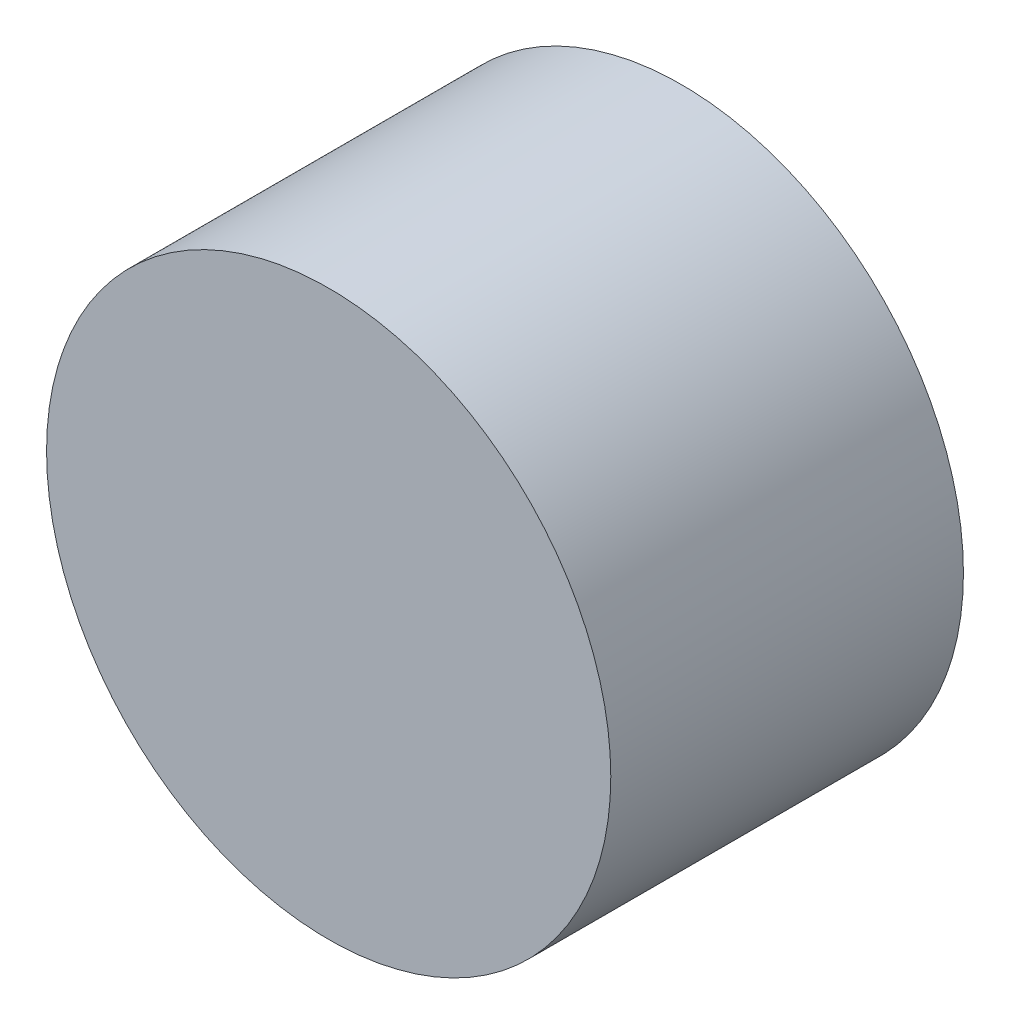
ISO-10303-21;
HEADER;
FILE_DESCRIPTION(('STEP AP214'),'2;1');
FILE_NAME('part.step','',(''),(''),'','','');
FILE_SCHEMA(('AUTOMOTIVE_DESIGN { 1 0 10303 214 1 1 1 1 }'));
ENDSEC;
DATA;
#1=APPLICATION_CONTEXT('core data for automotive mechanical design processes');
#2=APPLICATION_PROTOCOL_DEFINITION('international standard','automotive_design',2000,#1);
#3=PRODUCT_CONTEXT('',#1,'mechanical');
#4=PRODUCT('Part','Part','',(#3));
#5=PRODUCT_RELATED_PRODUCT_CATEGORY('part','',(#4));
#6=PRODUCT_DEFINITION_FORMATION('','',#4);
#7=PRODUCT_DEFINITION_CONTEXT('part definition',#1,'design');
#8=PRODUCT_DEFINITION('design','',#6,#7);
#9=PRODUCT_DEFINITION_SHAPE('','',#8);
#10=(LENGTH_UNIT() NAMED_UNIT(*) SI_UNIT(.MILLI.,.METRE.));
#11=(NAMED_UNIT(*) PLANE_ANGLE_UNIT() SI_UNIT($,.RADIAN.));
#12=(NAMED_UNIT(*) SI_UNIT($,.STERADIAN.) SOLID_ANGLE_UNIT());
#13=UNCERTAINTY_MEASURE_WITH_UNIT(LENGTH_MEASURE(1.E-05),#10,'distance_accuracy_value','');
#14=(GEOMETRIC_REPRESENTATION_CONTEXT(3) GLOBAL_UNCERTAINTY_ASSIGNED_CONTEXT((#13)) GLOBAL_UNIT_ASSIGNED_CONTEXT((#10,
#11,#12)) REPRESENTATION_CONTEXT('',''));
#15=CARTESIAN_POINT('',(0.,0.,0.));
#16=DIRECTION('',(0.,0.,1.));
#17=DIRECTION('',(1.,0.,0.));
#18=AXIS2_PLACEMENT_3D('',#15,#16,#17);
#19=CARTESIAN_POINT('',(0.,0.,12.5));
#20=DIRECTION('',(0.,0.,-1.));
#21=DIRECTION('',(-1.,0.,0.));
#22=AXIS2_PLACEMENT_3D('',#19,#20,#21);
#23=CYLINDRICAL_SURFACE('',#22,10.);
#24=CARTESIAN_POINT('',(0.,0.,12.5));
#25=DIRECTION('',(0.,0.,1.));
#26=DIRECTION('',(1.,0.,0.));
#27=AXIS2_PLACEMENT_3D('',#24,#25,#26);
#28=CIRCLE('',#27,10.);
#29=CARTESIAN_POINT('',(10.,0.,12.5));
#30=VERTEX_POINT('',#29);
#31=EDGE_CURVE('E10',#30,#30,#28,.T.);
#32=ORIENTED_EDGE('',*,*,#31,.F.);
#33=EDGE_LOOP('',(#32));
#34=FACE_BOUND('',#33,.T.);
#35=CARTESIAN_POINT('',(0.,0.,0.));
#36=DIRECTION('',(0.,0.,1.));
#37=DIRECTION('',(1.,0.,0.));
#38=AXIS2_PLACEMENT_3D('',#35,#36,#37);
#39=CIRCLE('',#38,10.);
#40=CARTESIAN_POINT('',(10.,0.,0.));
#41=VERTEX_POINT('',#40);
#42=EDGE_CURVE('E34',#41,#41,#39,.T.);
#43=ORIENTED_EDGE('',*,*,#42,.T.);
#44=EDGE_LOOP('',(#43));
#45=FACE_BOUND('',#44,.T.);
#46=ADVANCED_FACE('F31',(#34,#45),#23,.T.);
#47=CARTESIAN_POINT('',(0.,0.,12.5));
#48=DIRECTION('',(0.,0.,1.));
#49=DIRECTION('',(1.,0.,0.));
#50=AXIS2_PLACEMENT_3D('',#47,#48,#49);
#51=PLANE('',#50);
#52=ORIENTED_EDGE('',*,*,#31,.T.);
#53=EDGE_LOOP('',(#52));
#54=FACE_BOUND('',#53,.T.);
#55=ADVANCED_FACE('F46',(#54),#51,.T.);
#56=CARTESIAN_POINT('',(0.,0.,0.));
#57=DIRECTION('',(0.,0.,1.));
#58=DIRECTION('',(1.,0.,0.));
#59=AXIS2_PLACEMENT_3D('',#56,#57,#58);
#60=PLANE('',#59);
#61=ORIENTED_EDGE('',*,*,#42,.F.);
#62=EDGE_LOOP('',(#61));
#63=FACE_BOUND('',#62,.T.);
#64=ADVANCED_FACE('F44',(#63),#60,.F.);
#65=CLOSED_SHELL('',(#46,#55,#64));
#66=MANIFOLD_SOLID_BREP('B2',#65);
#67=ADVANCED_BREP_SHAPE_REPRESENTATION('',(#18,#66),#14);
#68=SHAPE_DEFINITION_REPRESENTATION(#9,#67);
ENDSEC;
END-ISO-10303-21;
